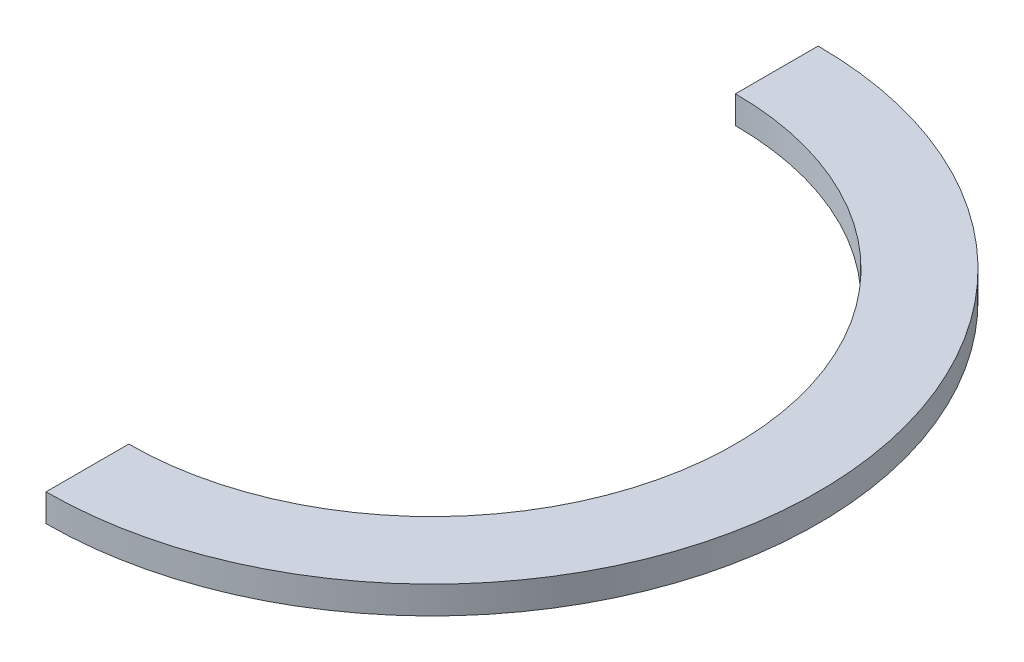
ISO-10303-21;
HEADER;
FILE_DESCRIPTION(('STEP AP214'),'2;1');
FILE_NAME('part.step','',(''),(''),'','','');
FILE_SCHEMA(('AUTOMOTIVE_DESIGN { 1 0 10303 214 1 1 1 1 }'));
ENDSEC;
DATA;
#1=APPLICATION_CONTEXT('core data for automotive mechanical design processes');
#2=APPLICATION_PROTOCOL_DEFINITION('international standard','automotive_design',2000,#1);
#3=PRODUCT_CONTEXT('',#1,'mechanical');
#4=PRODUCT('Part','Part','',(#3));
#5=PRODUCT_RELATED_PRODUCT_CATEGORY('part','',(#4));
#6=PRODUCT_DEFINITION_FORMATION('','',#4);
#7=PRODUCT_DEFINITION_CONTEXT('part definition',#1,'design');
#8=PRODUCT_DEFINITION('design','',#6,#7);
#9=PRODUCT_DEFINITION_SHAPE('','',#8);
#10=(LENGTH_UNIT() NAMED_UNIT(*) SI_UNIT(.MILLI.,.METRE.));
#11=(NAMED_UNIT(*) PLANE_ANGLE_UNIT() SI_UNIT($,.RADIAN.));
#12=(NAMED_UNIT(*) SI_UNIT($,.STERADIAN.) SOLID_ANGLE_UNIT());
#13=UNCERTAINTY_MEASURE_WITH_UNIT(LENGTH_MEASURE(1.E-05),#10,'distance_accuracy_value','');
#14=(GEOMETRIC_REPRESENTATION_CONTEXT(3) GLOBAL_UNCERTAINTY_ASSIGNED_CONTEXT((#13)) GLOBAL_UNIT_ASSIGNED_CONTEXT((#10,
#11,#12)) REPRESENTATION_CONTEXT('',''));
#15=CARTESIAN_POINT('',(0.,0.,0.));
#16=DIRECTION('',(0.,0.,1.));
#17=DIRECTION('',(1.,0.,0.));
#18=AXIS2_PLACEMENT_3D('',#15,#16,#17);
#19=CARTESIAN_POINT('',(0.,1.,0.));
#20=DIRECTION('',(1.,0.,0.));
#21=DIRECTION('',(0.,0.,-1.));
#22=AXIS2_PLACEMENT_3D('',#19,#20,#21);
#23=PLANE('',#22);
#24=DIRECTION('',(0.,0.,1.));
#25=VECTOR('',#24,1.);
#26=CARTESIAN_POINT('',(0.,0.,0.));
#27=LINE('',#26,#25);
#28=CARTESIAN_POINT('',(0.,0.,11.));
#29=VERTEX_POINT('',#28);
#30=CARTESIAN_POINT('',(0.,0.,14.));
#31=VERTEX_POINT('',#30);
#32=EDGE_CURVE('E120',#29,#31,#27,.T.);
#33=ORIENTED_EDGE('',*,*,#32,.T.);
#34=DIRECTION('',(0.,-1.,0.));
#35=VECTOR('',#34,1.);
#36=CARTESIAN_POINT('',(0.,1.,14.));
#37=LINE('',#36,#35);
#38=CARTESIAN_POINT('',(0.,1.,14.));
#39=VERTEX_POINT('',#38);
#40=EDGE_CURVE('E11',#39,#31,#37,.T.);
#41=ORIENTED_EDGE('',*,*,#40,.F.);
#42=DIRECTION('',(0.,0.,1.));
#43=VECTOR('',#42,1.);
#44=CARTESIAN_POINT('',(0.,1.,0.));
#45=LINE('',#44,#43);
#46=CARTESIAN_POINT('',(0.,1.,11.));
#47=VERTEX_POINT('',#46);
#48=EDGE_CURVE('E96',#47,#39,#45,.T.);
#49=ORIENTED_EDGE('',*,*,#48,.F.);
#50=DIRECTION('',(0.,-1.,0.));
#51=VECTOR('',#50,1.);
#52=CARTESIAN_POINT('',(0.,1.,11.));
#53=LINE('',#52,#51);
#54=EDGE_CURVE('E63',#47,#29,#53,.T.);
#55=ORIENTED_EDGE('',*,*,#54,.T.);
#56=EDGE_LOOP('',(#33,#41,#49,#55));
#57=FACE_BOUND('',#56,.T.);
#58=ADVANCED_FACE('F45',(#57),#23,.F.);
#59=CARTESIAN_POINT('',(0.,1.,0.));
#60=DIRECTION('',(0.,-1.,0.));
#61=DIRECTION('',(0.,0.,-1.));
#62=AXIS2_PLACEMENT_3D('',#59,#60,#61);
#63=CYLINDRICAL_SURFACE('',#62,14.);
#64=CARTESIAN_POINT('',(0.,0.,0.));
#65=DIRECTION('',(0.,1.,0.));
#66=DIRECTION('',(0.,0.,1.));
#67=AXIS2_PLACEMENT_3D('',#64,#65,#66);
#68=CIRCLE('',#67,14.);
#69=CARTESIAN_POINT('',(0.,0.,-14.));
#70=VERTEX_POINT('',#69);
#71=EDGE_CURVE('E101',#31,#70,#68,.T.);
#72=ORIENTED_EDGE('',*,*,#71,.T.);
#73=DIRECTION('',(0.,-1.,0.));
#74=VECTOR('',#73,1.);
#75=CARTESIAN_POINT('',(0.,1.,-14.));
#76=LINE('',#75,#74);
#77=CARTESIAN_POINT('',(0.,1.,-14.));
#78=VERTEX_POINT('',#77);
#79=EDGE_CURVE('E55',#78,#70,#76,.T.);
#80=ORIENTED_EDGE('',*,*,#79,.F.);
#81=CARTESIAN_POINT('',(0.,1.,0.));
#82=DIRECTION('',(0.,1.,0.));
#83=DIRECTION('',(0.,0.,1.));
#84=AXIS2_PLACEMENT_3D('',#81,#82,#83);
#85=CIRCLE('',#84,14.);
#86=EDGE_CURVE('E89',#39,#78,#85,.T.);
#87=ORIENTED_EDGE('',*,*,#86,.F.);
#88=ORIENTED_EDGE('',*,*,#40,.T.);
#89=EDGE_LOOP('',(#72,#80,#87,#88));
#90=FACE_BOUND('',#89,.T.);
#91=ADVANCED_FACE('F47',(#90),#63,.T.);
#92=CARTESIAN_POINT('',(0.,0.,-11.));
#93=VERTEX_POINT('',#92);
#94=EDGE_CURVE('E115',#70,#93,#27,.T.);
#95=ORIENTED_EDGE('',*,*,#94,.T.);
#96=DIRECTION('',(0.,-1.,0.));
#97=VECTOR('',#96,1.);
#98=CARTESIAN_POINT('',(0.,1.,-11.));
#99=LINE('',#98,#97);
#100=CARTESIAN_POINT('',(0.,1.,-11.));
#101=VERTEX_POINT('',#100);
#102=EDGE_CURVE('E78',#101,#93,#99,.T.);
#103=ORIENTED_EDGE('',*,*,#102,.F.);
#104=EDGE_CURVE('E95',#78,#101,#45,.T.);
#105=ORIENTED_EDGE('',*,*,#104,.F.);
#106=ORIENTED_EDGE('',*,*,#79,.T.);
#107=EDGE_LOOP('',(#95,#103,#105,#106));
#108=FACE_BOUND('',#107,.T.);
#109=ADVANCED_FACE('F105',(#108),#23,.F.);
#110=CARTESIAN_POINT('',(0.,1.,0.));
#111=DIRECTION('',(0.,-1.,0.));
#112=DIRECTION('',(0.,0.,-1.));
#113=AXIS2_PLACEMENT_3D('',#110,#111,#112);
#114=CYLINDRICAL_SURFACE('',#113,11.);
#115=CARTESIAN_POINT('',(0.,0.,0.));
#116=DIRECTION('',(0.,1.,0.));
#117=DIRECTION('',(0.,0.,1.));
#118=AXIS2_PLACEMENT_3D('',#115,#116,#117);
#119=CIRCLE('',#118,11.);
#120=EDGE_CURVE('E112',#29,#93,#119,.T.);
#121=ORIENTED_EDGE('',*,*,#120,.F.);
#122=ORIENTED_EDGE('',*,*,#54,.F.);
#123=CARTESIAN_POINT('',(0.,1.,0.));
#124=DIRECTION('',(0.,1.,0.));
#125=DIRECTION('',(0.,0.,1.));
#126=AXIS2_PLACEMENT_3D('',#123,#124,#125);
#127=CIRCLE('',#126,11.);
#128=EDGE_CURVE('E107',#47,#101,#127,.T.);
#129=ORIENTED_EDGE('',*,*,#128,.T.);
#130=ORIENTED_EDGE('',*,*,#102,.T.);
#131=EDGE_LOOP('',(#121,#122,#129,#130));
#132=FACE_BOUND('',#131,.T.);
#133=ADVANCED_FACE('F129',(#132),#114,.F.);
#134=CARTESIAN_POINT('',(0.,1.,0.));
#135=DIRECTION('',(0.,1.,0.));
#136=DIRECTION('',(0.,0.,1.));
#137=AXIS2_PLACEMENT_3D('',#134,#135,#136);
#138=PLANE('',#137);
#139=ORIENTED_EDGE('',*,*,#48,.T.);
#140=ORIENTED_EDGE('',*,*,#86,.T.);
#141=ORIENTED_EDGE('',*,*,#104,.T.);
#142=ORIENTED_EDGE('',*,*,#128,.F.);
#143=EDGE_LOOP('',(#139,#140,#141,#142));
#144=FACE_BOUND('',#143,.T.);
#145=ADVANCED_FACE('F92',(#144),#138,.T.);
#146=CARTESIAN_POINT('',(0.,0.,0.));
#147=DIRECTION('',(0.,1.,0.));
#148=DIRECTION('',(0.,0.,1.));
#149=AXIS2_PLACEMENT_3D('',#146,#147,#148);
#150=PLANE('',#149);
#151=ORIENTED_EDGE('',*,*,#32,.F.);
#152=ORIENTED_EDGE('',*,*,#120,.T.);
#153=ORIENTED_EDGE('',*,*,#94,.F.);
#154=ORIENTED_EDGE('',*,*,#71,.F.);
#155=EDGE_LOOP('',(#151,#152,#153,#154));
#156=FACE_BOUND('',#155,.T.);
#157=ADVANCED_FACE('F128',(#156),#150,.F.);
#158=CLOSED_SHELL('',(#58,#91,#109,#133,#145,#157));
#159=MANIFOLD_SOLID_BREP('B2',#158);
#160=ADVANCED_BREP_SHAPE_REPRESENTATION('',(#18,#159),#14);
#161=SHAPE_DEFINITION_REPRESENTATION(#9,#160);
ENDSEC;
END-ISO-10303-21;
